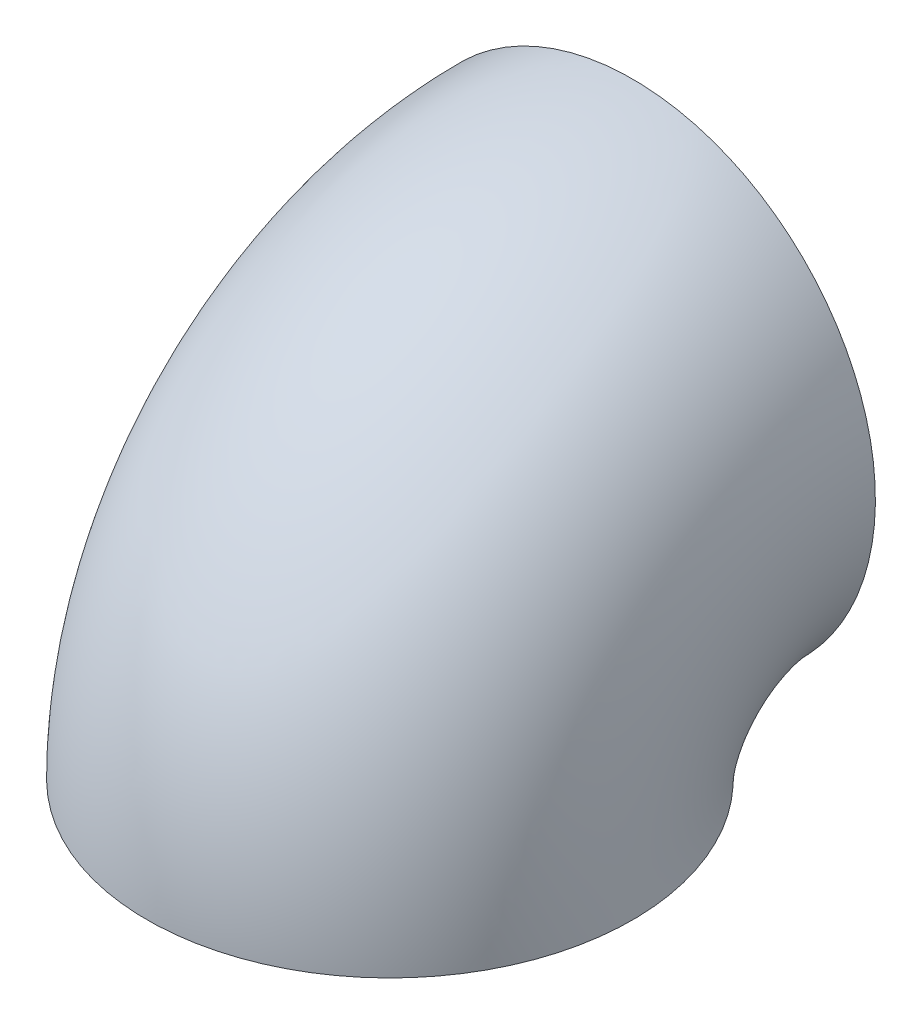
ISO-10303-21;
HEADER;
FILE_DESCRIPTION(('STEP AP214'),'2;1');
FILE_NAME('part.step','',(''),(''),'','','');
FILE_SCHEMA(('AUTOMOTIVE_DESIGN { 1 0 10303 214 1 1 1 1 }'));
ENDSEC;
DATA;
#1=APPLICATION_CONTEXT('core data for automotive mechanical design processes');
#2=APPLICATION_PROTOCOL_DEFINITION('international standard','automotive_design',2000,#1);
#3=PRODUCT_CONTEXT('',#1,'mechanical');
#4=PRODUCT('Part','Part','',(#3));
#5=PRODUCT_RELATED_PRODUCT_CATEGORY('part','',(#4));
#6=PRODUCT_DEFINITION_FORMATION('','',#4);
#7=PRODUCT_DEFINITION_CONTEXT('part definition',#1,'design');
#8=PRODUCT_DEFINITION('design','',#6,#7);
#9=PRODUCT_DEFINITION_SHAPE('','',#8);
#10=(LENGTH_UNIT() NAMED_UNIT(*) SI_UNIT(.MILLI.,.METRE.));
#11=(NAMED_UNIT(*) PLANE_ANGLE_UNIT() SI_UNIT($,.RADIAN.));
#12=(NAMED_UNIT(*) SI_UNIT($,.STERADIAN.) SOLID_ANGLE_UNIT());
#13=UNCERTAINTY_MEASURE_WITH_UNIT(LENGTH_MEASURE(1.E-05),#10,'distance_accuracy_value','');
#14=(GEOMETRIC_REPRESENTATION_CONTEXT(3) GLOBAL_UNCERTAINTY_ASSIGNED_CONTEXT((#13)) GLOBAL_UNIT_ASSIGNED_CONTEXT((#10,
#11,#12)) REPRESENTATION_CONTEXT('',''));
#15=CARTESIAN_POINT('',(0.,0.,0.));
#16=DIRECTION('',(0.,0.,1.));
#17=DIRECTION('',(1.,0.,0.));
#18=AXIS2_PLACEMENT_3D('',#15,#16,#17);
#19=CARTESIAN_POINT('',(0.,0.,-45.));
#20=DIRECTION('',(0.,-1.,0.));
#21=DIRECTION('',(0.,0.,-1.));
#22=AXIS2_PLACEMENT_3D('',#19,#20,#21);
#23=CIRCLE('',#22,45.);
#24=TRIMMED_CURVE('',#23,(PARAMETER_VALUE(-3.14159262378747)),
(PARAMETER_VALUE(3.14159262378747)),.T.,.PARAMETER.);
#25=CARTESIAN_POINT('',(0.,0.,0.));
#26=DIRECTION('',(1.,0.,0.));
#27=AXIS1_PLACEMENT('',#25,#26);
#28=SURFACE_OF_REVOLUTION('',#24,#27);
#29=CARTESIAN_POINT('',(0.,0.,45.));
#30=DIRECTION('',(0.,1.,0.));
#31=DIRECTION('',(0.,0.,1.));
#32=AXIS2_PLACEMENT_3D('',#29,#30,#31);
#33=CIRCLE('',#32,45.);
#34=CARTESIAN_POINT('',(0.,0.,0.));
#35=VERTEX_POINT('',#34);
#36=EDGE_CURVE('E49',#35,#35,#33,.T.);
#37=ORIENTED_EDGE('',*,*,#36,.T.);
#38=CARTESIAN_POINT('',(0.,45.,0.));
#39=DIRECTION('',(0.,0.,-1.));
#40=DIRECTION('',(0.,1.,0.));
#41=AXIS2_PLACEMENT_3D('',#38,#39,#40);
#42=CIRCLE('',#41,45.);
#43=EDGE_CURVE('E39',#35,#35,#42,.T.);
#44=ORIENTED_EDGE('',*,*,#43,.F.);
#45=EDGE_LOOP('',(#37,#44));
#46=FACE_BOUND('',#45,.T.);
#47=ADVANCED_FACE('F36',(#46),#28,.T.);
#48=CARTESIAN_POINT('',(0.,45.,0.));
#49=DIRECTION('',(0.,0.,-1.));
#50=DIRECTION('',(0.,1.,0.));
#51=AXIS2_PLACEMENT_3D('',#48,#49,#50);
#52=PLANE('',#51);
#53=CARTESIAN_POINT('',(0.,45.,0.));
#54=DIRECTION('',(0.,0.,-1.));
#55=DIRECTION('',(0.,1.,0.));
#56=AXIS2_PLACEMENT_3D('',#53,#54,#55);
#57=CIRCLE('',#56,10.);
#58=CARTESIAN_POINT('',(0.,55.,0.));
#59=VERTEX_POINT('',#58);
#60=EDGE_CURVE('E43',#59,#59,#57,.F.);
#61=ORIENTED_EDGE('',*,*,#60,.T.);
#62=EDGE_LOOP('',(#61));
#63=FACE_BOUND('',#62,.T.);
#64=ORIENTED_EDGE('',*,*,#43,.T.);
#65=EDGE_LOOP('',(#64));
#66=FACE_BOUND('',#65,.T.);
#67=ADVANCED_FACE('F53',(#63,#66),#52,.T.);
#68=CARTESIAN_POINT('',(0.,0.,45.));
#69=DIRECTION('',(0.,1.,0.));
#70=DIRECTION('',(0.,0.,1.));
#71=AXIS2_PLACEMENT_3D('',#68,#69,#70);
#72=PLANE('',#71);
#73=CARTESIAN_POINT('',(0.,0.,45.));
#74=DIRECTION('',(0.,1.,0.));
#75=DIRECTION('',(0.,0.,1.));
#76=AXIS2_PLACEMENT_3D('',#73,#74,#75);
#77=CIRCLE('',#76,10.);
#78=CARTESIAN_POINT('',(0.,0.,55.));
#79=VERTEX_POINT('',#78);
#80=EDGE_CURVE('E11',#79,#79,#77,.F.);
#81=ORIENTED_EDGE('',*,*,#80,.F.);
#82=EDGE_LOOP('',(#81));
#83=FACE_BOUND('',#82,.T.);
#84=ORIENTED_EDGE('',*,*,#36,.F.);
#85=EDGE_LOOP('',(#84));
#86=FACE_BOUND('',#85,.T.);
#87=ADVANCED_FACE('F55',(#83,#86),#72,.F.);
#88=CARTESIAN_POINT('',(0.,0.,0.));
#89=DIRECTION('',(1.,0.,0.));
#90=DIRECTION('',(0.,0.,-1.));
#91=AXIS2_PLACEMENT_3D('',#88,#89,#90);
#92=TOROIDAL_SURFACE('',#91,45.,10.);
#93=CARTESIAN_POINT('',(0.,0.,0.));
#94=DIRECTION('',(1.,0.,0.));
#95=DIRECTION('',(0.,0.,-1.));
#96=AXIS2_PLACEMENT_3D('',#93,#94,#95);
#97=CIRCLE('',#96,55.);
#98=EDGE_CURVE('',#59,#79,#97,.T.);
#99=ORIENTED_EDGE('',*,*,#60,.F.);
#100=ORIENTED_EDGE('',*,*,#80,.T.);
#101=ORIENTED_EDGE('',*,*,#98,.T.);
#102=ORIENTED_EDGE('',*,*,#98,.F.);
#103=EDGE_LOOP('',(#99,#101,#100,#102));
#104=FACE_BOUND('',#103,.T.);
#105=ADVANCED_FACE('F61',(#104),#92,.F.);
#106=CLOSED_SHELL('',(#47,#67,#87,#105));
#107=MANIFOLD_SOLID_BREP('B2',#106);
#108=ADVANCED_BREP_SHAPE_REPRESENTATION('',(#18,#107),#14);
#109=SHAPE_DEFINITION_REPRESENTATION(#9,#108);
ENDSEC;
END-ISO-10303-21;
